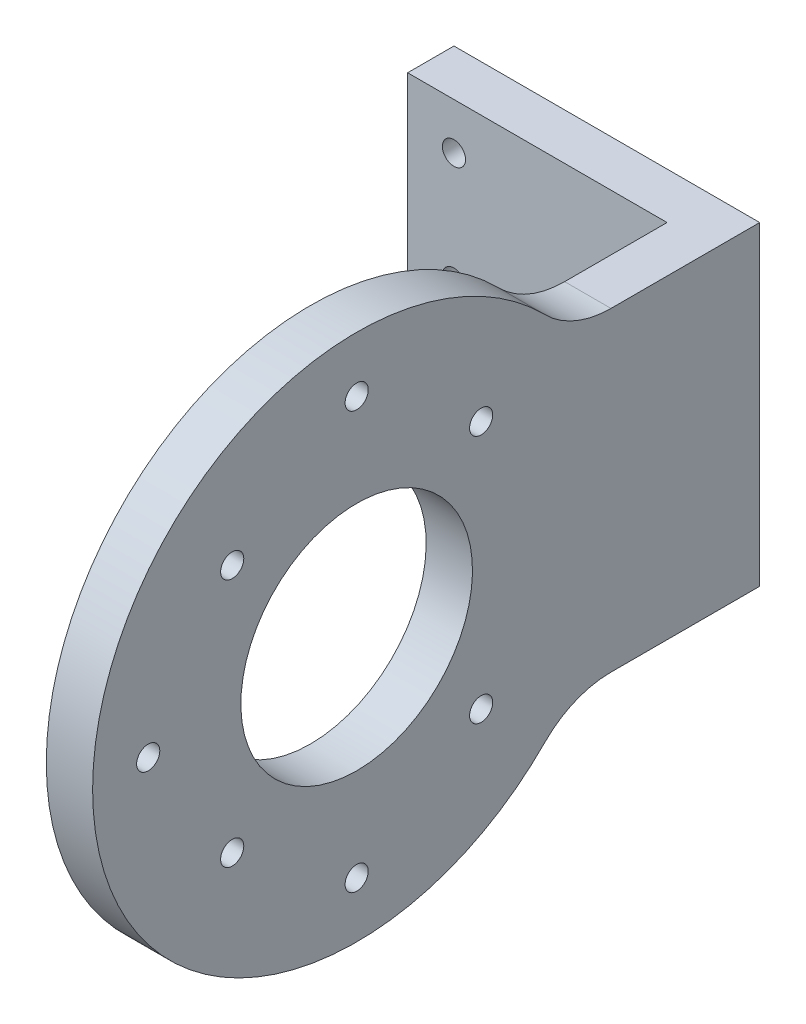
ISO-10303-21;
HEADER;
FILE_DESCRIPTION(('STEP AP214'),'2;1');
FILE_NAME('part.step','',(''),(''),'','','');
FILE_SCHEMA(('AUTOMOTIVE_DESIGN { 1 0 10303 214 1 1 1 1 }'));
ENDSEC;
DATA;
#1=APPLICATION_CONTEXT('core data for automotive mechanical design processes');
#2=APPLICATION_PROTOCOL_DEFINITION('international standard','automotive_design',2000,#1);
#3=PRODUCT_CONTEXT('',#1,'mechanical');
#4=PRODUCT('Part','Part','',(#3));
#5=PRODUCT_RELATED_PRODUCT_CATEGORY('part','',(#4));
#6=PRODUCT_DEFINITION_FORMATION('','',#4);
#7=PRODUCT_DEFINITION_CONTEXT('part definition',#1,'design');
#8=PRODUCT_DEFINITION('design','',#6,#7);
#9=PRODUCT_DEFINITION_SHAPE('','',#8);
#10=(LENGTH_UNIT() NAMED_UNIT(*) SI_UNIT(.MILLI.,.METRE.));
#11=(NAMED_UNIT(*) PLANE_ANGLE_UNIT() SI_UNIT($,.RADIAN.));
#12=(NAMED_UNIT(*) SI_UNIT($,.STERADIAN.) SOLID_ANGLE_UNIT());
#13=UNCERTAINTY_MEASURE_WITH_UNIT(LENGTH_MEASURE(1.E-05),#10,'distance_accuracy_value','');
#14=(GEOMETRIC_REPRESENTATION_CONTEXT(3) GLOBAL_UNCERTAINTY_ASSIGNED_CONTEXT((#13)) GLOBAL_UNIT_ASSIGNED_CONTEXT((#10,
#11,#12)) REPRESENTATION_CONTEXT('',''));
#15=CARTESIAN_POINT('',(0.,0.,0.));
#16=DIRECTION('',(0.,0.,1.));
#17=DIRECTION('',(1.,0.,0.));
#18=AXIS2_PLACEMENT_3D('',#15,#16,#17);
#19=CARTESIAN_POINT('',(28.,17.,5.));
#20=DIRECTION('',(-1.,0.,0.));
#21=DIRECTION('',(0.,-1.,0.));
#22=AXIS2_PLACEMENT_3D('',#19,#20,#21);
#23=PLANE('',#22);
#24=CARTESIAN_POINT('',(28.,0.,66.));
#25=DIRECTION('',(1.,0.,0.));
#26=DIRECTION('',(0.,0.,1.));
#27=AXIS2_PLACEMENT_3D('',#24,#25,#26);
#28=CIRCLE('',#27,1.25);
#29=CARTESIAN_POINT('',(28.,0.,67.25));
#30=VERTEX_POINT('',#29);
#31=EDGE_CURVE('E198',#30,#30,#28,.T.);
#32=ORIENTED_EDGE('',*,*,#31,.F.);
#33=EDGE_LOOP('',(#32));
#34=FACE_BOUND('',#33,.T.);
#35=CARTESIAN_POINT('',(28.,-22.5,43.5));
#36=DIRECTION('',(1.,0.,0.));
#37=DIRECTION('',(0.,-1.,0.));
#38=AXIS2_PLACEMENT_3D('',#35,#36,#37);
#39=CIRCLE('',#38,1.25);
#40=CARTESIAN_POINT('',(28.,-23.75,43.5));
#41=VERTEX_POINT('',#40);
#42=EDGE_CURVE('E205',#41,#41,#39,.T.);
#43=ORIENTED_EDGE('',*,*,#42,.F.);
#44=EDGE_LOOP('',(#43));
#45=FACE_BOUND('',#44,.T.);
#46=CARTESIAN_POINT('',(28.,22.5,43.5));
#47=DIRECTION('',(1.,0.,0.));
#48=DIRECTION('',(0.,1.,0.));
#49=AXIS2_PLACEMENT_3D('',#46,#47,#48);
#50=CIRCLE('',#49,1.25);
#51=CARTESIAN_POINT('',(28.,23.75,43.5));
#52=VERTEX_POINT('',#51);
#53=EDGE_CURVE('E194',#52,#52,#50,.T.);
#54=ORIENTED_EDGE('',*,*,#53,.F.);
#55=EDGE_LOOP('',(#54));
#56=FACE_BOUND('',#55,.T.);
#57=CARTESIAN_POINT('',(28.,-13.4350288425442,56.9350288425446));
#58=DIRECTION('',(-1.,0.,0.));
#59=DIRECTION('',(0.,0.,-1.));
#60=AXIS2_PLACEMENT_3D('',#57,#58,#59);
#61=CIRCLE('',#60,1.25);
#62=CARTESIAN_POINT('',(28.,-13.4350288425442,55.6850288425446));
#63=VERTEX_POINT('',#62);
#64=EDGE_CURVE('E240',#63,#63,#61,.T.);
#65=ORIENTED_EDGE('',*,*,#64,.T.);
#66=EDGE_LOOP('',(#65));
#67=FACE_BOUND('',#66,.T.);
#68=CARTESIAN_POINT('',(28.,-13.4350288425444,30.0649711574557));
#69=DIRECTION('',(-1.,0.,0.));
#70=DIRECTION('',(0.,1.,0.));
#71=AXIS2_PLACEMENT_3D('',#68,#69,#70);
#72=CIRCLE('',#71,1.25);
#73=CARTESIAN_POINT('',(28.,-12.1850288425444,30.0649711574557));
#74=VERTEX_POINT('',#73);
#75=EDGE_CURVE('E248',#74,#74,#72,.T.);
#76=ORIENTED_EDGE('',*,*,#75,.T.);
#77=EDGE_LOOP('',(#76));
#78=FACE_BOUND('',#77,.T.);
#79=CARTESIAN_POINT('',(28.,13.4350288425443,30.0649711574556));
#80=DIRECTION('',(-1.,0.,0.));
#81=DIRECTION('',(0.,0.,1.));
#82=AXIS2_PLACEMENT_3D('',#79,#80,#81);
#83=CIRCLE('',#82,1.25);
#84=CARTESIAN_POINT('',(28.,13.4350288425443,31.3149711574556));
#85=VERTEX_POINT('',#84);
#86=EDGE_CURVE('E256',#85,#85,#83,.T.);
#87=ORIENTED_EDGE('',*,*,#86,.T.);
#88=EDGE_LOOP('',(#87));
#89=FACE_BOUND('',#88,.T.);
#90=CARTESIAN_POINT('',(28.,0.,43.5000000000001));
#91=DIRECTION('',(-1.,0.,0.));
#92=DIRECTION('',(0.,-1.,0.));
#93=AXIS2_PLACEMENT_3D('',#90,#91,#92);
#94=CIRCLE('',#93,12.5);
#95=CARTESIAN_POINT('',(28.,-12.5,43.5000000000001));
#96=VERTEX_POINT('',#95);
#97=EDGE_CURVE('E260',#96,#96,#94,.T.);
#98=ORIENTED_EDGE('',*,*,#97,.T.);
#99=EDGE_LOOP('',(#98));
#100=FACE_BOUND('',#99,.T.);
#101=CARTESIAN_POINT('',(28.,13.4350288425444,56.9350288425444));
#102=DIRECTION('',(-1.,0.,0.));
#103=DIRECTION('',(0.,-1.,0.));
#104=AXIS2_PLACEMENT_3D('',#101,#102,#103);
#105=CIRCLE('',#104,1.25);
#106=CARTESIAN_POINT('',(28.,12.1850288425444,56.9350288425444));
#107=VERTEX_POINT('',#106);
#108=EDGE_CURVE('E272',#107,#107,#105,.T.);
#109=ORIENTED_EDGE('',*,*,#108,.T.);
#110=EDGE_LOOP('',(#109));
#111=FACE_BOUND('',#110,.T.);
#112=CARTESIAN_POINT('',(28.,0.,43.5));
#113=DIRECTION('',(-1.,0.,0.));
#114=DIRECTION('',(0.,-1.,0.));
#115=AXIS2_PLACEMENT_3D('',#112,#113,#114);
#116=CIRCLE('',#115,28.5);
#117=CARTESIAN_POINT('',(28.,-19.987012987013,23.1832750705983));
#118=VERTEX_POINT('',#117);
#119=CARTESIAN_POINT('',(28.,19.987012987013,23.1832750705983));
#120=VERTEX_POINT('',#119);
#121=EDGE_CURVE('E129',#118,#120,#116,.T.);
#122=ORIENTED_EDGE('',*,*,#121,.F.);
#123=CARTESIAN_POINT('',(28.,-27.,16.0545996567731));
#124=DIRECTION('',(-1.,0.,0.));
#125=DIRECTION('',(0.,-1.,0.));
#126=AXIS2_PLACEMENT_3D('',#123,#124,#125);
#127=CIRCLE('',#126,10.);
#128=CARTESIAN_POINT('',(28.,-17.,16.0545996567731));
#129=VERTEX_POINT('',#128);
#130=EDGE_CURVE('E11',#118,#129,#127,.T.);
#131=ORIENTED_EDGE('',*,*,#130,.T.);
#132=DIRECTION('',(0.,0.,-1.));
#133=VECTOR('',#132,1.);
#134=CARTESIAN_POINT('',(28.,-17.,5.));
#135=LINE('',#134,#133);
#136=CARTESIAN_POINT('',(28.,-17.,0.));
#137=VERTEX_POINT('',#136);
#138=EDGE_CURVE('E167',#129,#137,#135,.T.);
#139=ORIENTED_EDGE('',*,*,#138,.T.);
#140=DIRECTION('',(0.,1.,0.));
#141=VECTOR('',#140,1.);
#142=CARTESIAN_POINT('',(28.,17.,0.));
#143=LINE('',#142,#141);
#144=CARTESIAN_POINT('',(28.,17.,0.));
#145=VERTEX_POINT('',#144);
#146=EDGE_CURVE('E119',#137,#145,#143,.T.);
#147=ORIENTED_EDGE('',*,*,#146,.T.);
#148=DIRECTION('',(0.,0.,-1.));
#149=VECTOR('',#148,1.);
#150=CARTESIAN_POINT('',(28.,17.,5.));
#151=LINE('',#150,#149);
#152=CARTESIAN_POINT('',(28.,17.,16.0545996567731));
#153=VERTEX_POINT('',#152);
#154=EDGE_CURVE('E164',#153,#145,#151,.T.);
#155=ORIENTED_EDGE('',*,*,#154,.F.);
#156=CARTESIAN_POINT('',(28.,27.,16.0545996567731));
#157=DIRECTION('',(-1.,0.,0.));
#158=DIRECTION('',(0.,-1.,0.));
#159=AXIS2_PLACEMENT_3D('',#156,#157,#158);
#160=CIRCLE('',#159,10.);
#161=EDGE_CURVE('E180',#153,#120,#160,.T.);
#162=ORIENTED_EDGE('',*,*,#161,.T.);
#163=EDGE_LOOP('',(#122,#131,#139,#147,#155,#162));
#164=FACE_BOUND('',#163,.T.);
#165=ADVANCED_FACE('F43',(#34,#45,#56,#67,#78,#89,#100,#111,#164),#23,.F.);
#166=CARTESIAN_POINT('',(23.,0.,0.));
#167=DIRECTION('',(1.,0.,0.));
#168=DIRECTION('',(0.,1.,0.));
#169=AXIS2_PLACEMENT_3D('',#166,#167,#168);
#170=PLANE('',#169);
#171=CARTESIAN_POINT('',(23.,0.,66.));
#172=DIRECTION('',(1.,0.,0.));
#173=DIRECTION('',(0.,1.,0.));
#174=AXIS2_PLACEMENT_3D('',#171,#172,#173);
#175=CIRCLE('',#174,1.25);
#176=CARTESIAN_POINT('',(23.,1.24999999999991,66.));
#177=VERTEX_POINT('',#176);
#178=EDGE_CURVE('E47',#177,#177,#175,.T.);
#179=ORIENTED_EDGE('',*,*,#178,.T.);
#180=EDGE_LOOP('',(#179));
#181=FACE_BOUND('',#180,.T.);
#182=CARTESIAN_POINT('',(23.,-22.5,43.5));
#183=DIRECTION('',(1.,0.,0.));
#184=DIRECTION('',(0.,1.,0.));
#185=AXIS2_PLACEMENT_3D('',#182,#183,#184);
#186=CIRCLE('',#185,1.25);
#187=CARTESIAN_POINT('',(23.,-21.25,43.5));
#188=VERTEX_POINT('',#187);
#189=EDGE_CURVE('E195',#188,#188,#186,.T.);
#190=ORIENTED_EDGE('',*,*,#189,.T.);
#191=EDGE_LOOP('',(#190));
#192=FACE_BOUND('',#191,.T.);
#193=CARTESIAN_POINT('',(23.,22.5,43.5));
#194=DIRECTION('',(1.,0.,0.));
#195=DIRECTION('',(0.,1.,0.));
#196=AXIS2_PLACEMENT_3D('',#193,#194,#195);
#197=CIRCLE('',#196,1.25);
#198=CARTESIAN_POINT('',(23.,23.75,43.5));
#199=VERTEX_POINT('',#198);
#200=EDGE_CURVE('E190',#199,#199,#197,.T.);
#201=ORIENTED_EDGE('',*,*,#200,.T.);
#202=EDGE_LOOP('',(#201));
#203=FACE_BOUND('',#202,.T.);
#204=CARTESIAN_POINT('',(23.,-13.4350288425442,56.9350288425446));
#205=DIRECTION('',(-1.,0.,0.));
#206=DIRECTION('',(0.,0.,-1.));
#207=AXIS2_PLACEMENT_3D('',#204,#205,#206);
#208=CIRCLE('',#207,1.25);
#209=CARTESIAN_POINT('',(23.,-13.4350288425442,55.6850288425446));
#210=VERTEX_POINT('',#209);
#211=EDGE_CURVE('E236',#210,#210,#208,.T.);
#212=ORIENTED_EDGE('',*,*,#211,.F.);
#213=EDGE_LOOP('',(#212));
#214=FACE_BOUND('',#213,.T.);
#215=CARTESIAN_POINT('',(23.,-13.4350288425444,30.0649711574557));
#216=DIRECTION('',(-1.,0.,0.));
#217=DIRECTION('',(0.,1.,0.));
#218=AXIS2_PLACEMENT_3D('',#215,#216,#217);
#219=CIRCLE('',#218,1.25);
#220=CARTESIAN_POINT('',(23.,-12.1850288425444,30.0649711574557));
#221=VERTEX_POINT('',#220);
#222=EDGE_CURVE('E244',#221,#221,#219,.T.);
#223=ORIENTED_EDGE('',*,*,#222,.F.);
#224=EDGE_LOOP('',(#223));
#225=FACE_BOUND('',#224,.T.);
#226=CARTESIAN_POINT('',(23.,13.4350288425443,30.0649711574556));
#227=DIRECTION('',(-1.,0.,0.));
#228=DIRECTION('',(0.,0.,1.));
#229=AXIS2_PLACEMENT_3D('',#226,#227,#228);
#230=CIRCLE('',#229,1.25);
#231=CARTESIAN_POINT('',(23.,13.4350288425443,31.3149711574556));
#232=VERTEX_POINT('',#231);
#233=EDGE_CURVE('E252',#232,#232,#230,.T.);
#234=ORIENTED_EDGE('',*,*,#233,.F.);
#235=EDGE_LOOP('',(#234));
#236=FACE_BOUND('',#235,.T.);
#237=CARTESIAN_POINT('',(23.,0.,43.5000000000001));
#238=DIRECTION('',(-1.,0.,0.));
#239=DIRECTION('',(0.,-1.,0.));
#240=AXIS2_PLACEMENT_3D('',#237,#238,#239);
#241=CIRCLE('',#240,12.5);
#242=CARTESIAN_POINT('',(23.,-12.5,43.5000000000001));
#243=VERTEX_POINT('',#242);
#244=EDGE_CURVE('E264',#243,#243,#241,.T.);
#245=ORIENTED_EDGE('',*,*,#244,.F.);
#246=EDGE_LOOP('',(#245));
#247=FACE_BOUND('',#246,.T.);
#248=CARTESIAN_POINT('',(23.,13.4350288425444,56.9350288425444));
#249=DIRECTION('',(-1.,0.,0.));
#250=DIRECTION('',(0.,-1.,0.));
#251=AXIS2_PLACEMENT_3D('',#248,#249,#250);
#252=CIRCLE('',#251,1.25);
#253=CARTESIAN_POINT('',(23.,12.1850288425444,56.9350288425444));
#254=VERTEX_POINT('',#253);
#255=EDGE_CURVE('E268',#254,#254,#252,.T.);
#256=ORIENTED_EDGE('',*,*,#255,.F.);
#257=EDGE_LOOP('',(#256));
#258=FACE_BOUND('',#257,.T.);
#259=DIRECTION('',(0.,0.,-1.));
#260=VECTOR('',#259,1.);
#261=CARTESIAN_POINT('',(23.,-16.9999999999998,72.));
#262=LINE('',#261,#260);
#263=CARTESIAN_POINT('',(23.,-17.,16.0545996567731));
#264=VERTEX_POINT('',#263);
#265=CARTESIAN_POINT('',(23.,-17.,5.));
#266=VERTEX_POINT('',#265);
#267=EDGE_CURVE('E108',#264,#266,#262,.T.);
#268=ORIENTED_EDGE('',*,*,#267,.F.);
#269=CARTESIAN_POINT('',(23.,-27.,16.0545996567731));
#270=DIRECTION('',(1.,0.,0.));
#271=DIRECTION('',(0.,1.,0.));
#272=AXIS2_PLACEMENT_3D('',#269,#270,#271);
#273=CIRCLE('',#272,10.);
#274=CARTESIAN_POINT('',(23.,-19.987012987013,23.1832750705983));
#275=VERTEX_POINT('',#274);
#276=EDGE_CURVE('E53',#264,#275,#273,.T.);
#277=ORIENTED_EDGE('',*,*,#276,.T.);
#278=CARTESIAN_POINT('',(23.,0.,43.5));
#279=DIRECTION('',(-1.,0.,0.));
#280=DIRECTION('',(0.,-1.,0.));
#281=AXIS2_PLACEMENT_3D('',#278,#279,#280);
#282=CIRCLE('',#281,28.5);
#283=CARTESIAN_POINT('',(23.,19.987012987013,23.1832750705983));
#284=VERTEX_POINT('',#283);
#285=EDGE_CURVE('E276',#275,#284,#282,.T.);
#286=ORIENTED_EDGE('',*,*,#285,.T.);
#287=CARTESIAN_POINT('',(23.,27.,16.0545996567731));
#288=DIRECTION('',(1.,0.,0.));
#289=DIRECTION('',(0.,1.,0.));
#290=AXIS2_PLACEMENT_3D('',#287,#288,#289);
#291=CIRCLE('',#290,10.);
#292=CARTESIAN_POINT('',(23.,17.,16.0545996567731));
#293=VERTEX_POINT('',#292);
#294=EDGE_CURVE('E177',#284,#293,#291,.T.);
#295=ORIENTED_EDGE('',*,*,#294,.T.);
#296=DIRECTION('',(0.,0.,1.));
#297=VECTOR('',#296,1.);
#298=CARTESIAN_POINT('',(23.,17.,5.));
#299=LINE('',#298,#297);
#300=CARTESIAN_POINT('',(23.,17.,5.));
#301=VERTEX_POINT('',#300);
#302=EDGE_CURVE('E120',#301,#293,#299,.T.);
#303=ORIENTED_EDGE('',*,*,#302,.F.);
#304=DIRECTION('',(0.,1.,0.));
#305=VECTOR('',#304,1.);
#306=CARTESIAN_POINT('',(23.,17.,5.));
#307=LINE('',#306,#305);
#308=EDGE_CURVE('E123',#266,#301,#307,.T.);
#309=ORIENTED_EDGE('',*,*,#308,.F.);
#310=EDGE_LOOP('',(#268,#277,#286,#295,#303,#309));
#311=FACE_BOUND('',#310,.T.);
#312=ADVANCED_FACE('F124',(#181,#192,#203,#214,#225,#236,#247,#258,#311),#170,.F.);
#313=CARTESIAN_POINT('',(0.,0.,5.));
#314=DIRECTION('',(0.,0.,1.));
#315=DIRECTION('',(1.,0.,0.));
#316=AXIS2_PLACEMENT_3D('',#313,#314,#315);
#317=PLANE('',#316);
#318=CARTESIAN_POINT('',(0.,-12.,5.));
#319=DIRECTION('',(0.,0.,1.));
#320=DIRECTION('',(-1.,0.,0.));
#321=AXIS2_PLACEMENT_3D('',#318,#319,#320);
#322=CIRCLE('',#321,1.25);
#323=CARTESIAN_POINT('',(-1.25,-12.,5.));
#324=VERTEX_POINT('',#323);
#325=EDGE_CURVE('E225',#324,#324,#322,.T.);
#326=ORIENTED_EDGE('',*,*,#325,.F.);
#327=EDGE_LOOP('',(#326));
#328=FACE_BOUND('',#327,.T.);
#329=CARTESIAN_POINT('',(0.,12.,5.));
#330=DIRECTION('',(0.,0.,1.));
#331=DIRECTION('',(1.,0.,0.));
#332=AXIS2_PLACEMENT_3D('',#329,#330,#331);
#333=CIRCLE('',#332,1.25);
#334=CARTESIAN_POINT('',(1.25,12.,5.));
#335=VERTEX_POINT('',#334);
#336=EDGE_CURVE('E216',#335,#335,#333,.T.);
#337=ORIENTED_EDGE('',*,*,#336,.F.);
#338=EDGE_LOOP('',(#337));
#339=FACE_BOUND('',#338,.T.);
#340=CARTESIAN_POINT('',(0.,0.,5.));
#341=DIRECTION('',(0.,0.,1.));
#342=DIRECTION('',(1.,0.,0.));
#343=AXIS2_PLACEMENT_3D('',#340,#341,#342);
#344=CIRCLE('',#343,1.25);
#345=CARTESIAN_POINT('',(1.25,0.,5.));
#346=VERTEX_POINT('',#345);
#347=EDGE_CURVE('E220',#346,#346,#344,.T.);
#348=ORIENTED_EDGE('',*,*,#347,.F.);
#349=EDGE_LOOP('',(#348));
#350=FACE_BOUND('',#349,.T.);
#351=DIRECTION('',(1.,0.,0.));
#352=VECTOR('',#351,1.);
#353=CARTESIAN_POINT('',(28.,-17.,5.));
#354=LINE('',#353,#352);
#355=CARTESIAN_POINT('',(-5.,-17.,5.));
#356=VERTEX_POINT('',#355);
#357=EDGE_CURVE('E114',#356,#266,#354,.T.);
#358=ORIENTED_EDGE('',*,*,#357,.T.);
#359=ORIENTED_EDGE('',*,*,#308,.T.);
#360=DIRECTION('',(-1.,0.,0.));
#361=VECTOR('',#360,1.);
#362=CARTESIAN_POINT('',(23.,17.,5.));
#363=LINE('',#362,#361);
#364=CARTESIAN_POINT('',(-5.,17.,5.));
#365=VERTEX_POINT('',#364);
#366=EDGE_CURVE('E136',#301,#365,#363,.T.);
#367=ORIENTED_EDGE('',*,*,#366,.T.);
#368=DIRECTION('',(0.,-1.,0.));
#369=VECTOR('',#368,1.);
#370=CARTESIAN_POINT('',(-5.,17.,5.));
#371=LINE('',#370,#369);
#372=EDGE_CURVE('E133',#365,#356,#371,.T.);
#373=ORIENTED_EDGE('',*,*,#372,.T.);
#374=EDGE_LOOP('',(#358,#359,#367,#373));
#375=FACE_BOUND('',#374,.T.);
#376=ADVANCED_FACE('F131',(#328,#339,#350,#375),#317,.T.);
#377=CARTESIAN_POINT('',(-5.,17.,5.));
#378=DIRECTION('',(0.,-1.,0.));
#379=DIRECTION('',(0.,0.,-1.));
#380=AXIS2_PLACEMENT_3D('',#377,#378,#379);
#381=PLANE('',#380);
#382=ORIENTED_EDGE('',*,*,#302,.T.);
#383=DIRECTION('',(-1.,0.,0.));
#384=VECTOR('',#383,1.);
#385=CARTESIAN_POINT('',(-5.00000000000001,17.,16.0545996567731));
#386=LINE('',#385,#384);
#387=EDGE_CURVE('E174',#293,#153,#386,.F.);
#388=ORIENTED_EDGE('',*,*,#387,.T.);
#389=ORIENTED_EDGE('',*,*,#154,.T.);
#390=DIRECTION('',(-1.,0.,0.));
#391=VECTOR('',#390,1.);
#392=CARTESIAN_POINT('',(-5.,17.,0.));
#393=LINE('',#392,#391);
#394=CARTESIAN_POINT('',(-5.,17.,0.));
#395=VERTEX_POINT('',#394);
#396=EDGE_CURVE('E153',#145,#395,#393,.T.);
#397=ORIENTED_EDGE('',*,*,#396,.T.);
#398=DIRECTION('',(0.,0.,-1.));
#399=VECTOR('',#398,1.);
#400=CARTESIAN_POINT('',(-5.,17.,5.));
#401=LINE('',#400,#399);
#402=EDGE_CURVE('E160',#365,#395,#401,.T.);
#403=ORIENTED_EDGE('',*,*,#402,.F.);
#404=ORIENTED_EDGE('',*,*,#366,.F.);
#405=EDGE_LOOP('',(#382,#388,#389,#397,#403,#404));
#406=FACE_BOUND('',#405,.T.);
#407=ADVANCED_FACE('F286',(#406),#381,.F.);
#408=CARTESIAN_POINT('',(-5.,17.,5.));
#409=DIRECTION('',(1.,0.,0.));
#410=DIRECTION('',(0.,1.,0.));
#411=AXIS2_PLACEMENT_3D('',#408,#409,#410);
#412=PLANE('',#411);
#413=DIRECTION('',(0.,-1.,0.));
#414=VECTOR('',#413,1.);
#415=CARTESIAN_POINT('',(-5.,17.,0.));
#416=LINE('',#415,#414);
#417=CARTESIAN_POINT('',(-5.,-17.,0.));
#418=VERTEX_POINT('',#417);
#419=EDGE_CURVE('E143',#395,#418,#416,.T.);
#420=ORIENTED_EDGE('',*,*,#419,.T.);
#421=DIRECTION('',(0.,0.,-1.));
#422=VECTOR('',#421,1.);
#423=CARTESIAN_POINT('',(-5.,-17.,5.));
#424=LINE('',#423,#422);
#425=EDGE_CURVE('E149',#356,#418,#424,.T.);
#426=ORIENTED_EDGE('',*,*,#425,.F.);
#427=ORIENTED_EDGE('',*,*,#372,.F.);
#428=ORIENTED_EDGE('',*,*,#402,.T.);
#429=EDGE_LOOP('',(#420,#426,#427,#428));
#430=FACE_BOUND('',#429,.T.);
#431=ADVANCED_FACE('F303',(#430),#412,.F.);
#432=CARTESIAN_POINT('',(-5.,-17.,5.));
#433=DIRECTION('',(0.,1.,0.));
#434=DIRECTION('',(-1.,0.,0.));
#435=AXIS2_PLACEMENT_3D('',#432,#433,#434);
#436=PLANE('',#435);
#437=ORIENTED_EDGE('',*,*,#138,.F.);
#438=DIRECTION('',(-1.,0.,0.));
#439=VECTOR('',#438,1.);
#440=CARTESIAN_POINT('',(-5.,-17.,16.0545996567731));
#441=LINE('',#440,#439);
#442=EDGE_CURVE('E117',#129,#264,#441,.T.);
#443=ORIENTED_EDGE('',*,*,#442,.T.);
#444=ORIENTED_EDGE('',*,*,#267,.T.);
#445=ORIENTED_EDGE('',*,*,#357,.F.);
#446=ORIENTED_EDGE('',*,*,#425,.T.);
#447=DIRECTION('',(1.,0.,0.));
#448=VECTOR('',#447,1.);
#449=CARTESIAN_POINT('',(-5.,-17.,0.));
#450=LINE('',#449,#448);
#451=EDGE_CURVE('E137',#418,#137,#450,.T.);
#452=ORIENTED_EDGE('',*,*,#451,.T.);
#453=EDGE_LOOP('',(#437,#443,#444,#445,#446,#452));
#454=FACE_BOUND('',#453,.T.);
#455=ADVANCED_FACE('F111',(#454),#436,.F.);
#456=CARTESIAN_POINT('',(0.,0.,0.));
#457=DIRECTION('',(0.,0.,1.));
#458=DIRECTION('',(1.,0.,0.));
#459=AXIS2_PLACEMENT_3D('',#456,#457,#458);
#460=PLANE('',#459);
#461=CARTESIAN_POINT('',(0.,-12.,0.));
#462=DIRECTION('',(0.,0.,1.));
#463=DIRECTION('',(-1.,0.,0.));
#464=AXIS2_PLACEMENT_3D('',#461,#462,#463);
#465=CIRCLE('',#464,1.25);
#466=CARTESIAN_POINT('',(-1.25,-12.,0.));
#467=VERTEX_POINT('',#466);
#468=EDGE_CURVE('E193',#467,#467,#465,.T.);
#469=ORIENTED_EDGE('',*,*,#468,.T.);
#470=EDGE_LOOP('',(#469));
#471=FACE_BOUND('',#470,.T.);
#472=CARTESIAN_POINT('',(0.,12.,0.));
#473=DIRECTION('',(0.,0.,1.));
#474=DIRECTION('',(1.,0.,0.));
#475=AXIS2_PLACEMENT_3D('',#472,#473,#474);
#476=CIRCLE('',#475,1.25);
#477=CARTESIAN_POINT('',(1.25,12.,0.));
#478=VERTEX_POINT('',#477);
#479=EDGE_CURVE('E221',#478,#478,#476,.T.);
#480=ORIENTED_EDGE('',*,*,#479,.T.);
#481=EDGE_LOOP('',(#480));
#482=FACE_BOUND('',#481,.T.);
#483=CARTESIAN_POINT('',(0.,0.,0.));
#484=DIRECTION('',(0.,0.,1.));
#485=DIRECTION('',(1.,0.,0.));
#486=AXIS2_PLACEMENT_3D('',#483,#484,#485);
#487=CIRCLE('',#486,1.25);
#488=CARTESIAN_POINT('',(1.25,0.,0.));
#489=VERTEX_POINT('',#488);
#490=EDGE_CURVE('E232',#489,#489,#487,.T.);
#491=ORIENTED_EDGE('',*,*,#490,.T.);
#492=EDGE_LOOP('',(#491));
#493=FACE_BOUND('',#492,.T.);
#494=ORIENTED_EDGE('',*,*,#146,.F.);
#495=ORIENTED_EDGE('',*,*,#451,.F.);
#496=ORIENTED_EDGE('',*,*,#419,.F.);
#497=ORIENTED_EDGE('',*,*,#396,.F.);
#498=EDGE_LOOP('',(#494,#495,#496,#497));
#499=FACE_BOUND('',#498,.T.);
#500=ADVANCED_FACE('F300',(#471,#482,#493,#499),#460,.F.);
#501=CARTESIAN_POINT('',(28.,0.,43.5));
#502=DIRECTION('',(-1.,0.,0.));
#503=DIRECTION('',(0.,-1.,0.));
#504=AXIS2_PLACEMENT_3D('',#501,#502,#503);
#505=CYLINDRICAL_SURFACE('',#504,28.5);
#506=ORIENTED_EDGE('',*,*,#285,.F.);
#507=DIRECTION('',(-1.,0.,0.));
#508=VECTOR('',#507,1.);
#509=CARTESIAN_POINT('',(28.,-19.987012987013,23.1832750705983));
#510=LINE('',#509,#508);
#511=EDGE_CURVE('E67',#275,#118,#510,.F.);
#512=ORIENTED_EDGE('',*,*,#511,.T.);
#513=ORIENTED_EDGE('',*,*,#121,.T.);
#514=DIRECTION('',(-1.,0.,0.));
#515=VECTOR('',#514,1.);
#516=CARTESIAN_POINT('',(28.,19.987012987013,23.1832750705983));
#517=LINE('',#516,#515);
#518=EDGE_CURVE('E170',#120,#284,#517,.T.);
#519=ORIENTED_EDGE('',*,*,#518,.T.);
#520=EDGE_LOOP('',(#506,#512,#513,#519));
#521=FACE_BOUND('',#520,.T.);
#522=ADVANCED_FACE('F314',(#521),#505,.T.);
#523=CARTESIAN_POINT('',(28.,27.,16.0545996567731));
#524=DIRECTION('',(-1.,0.,0.));
#525=DIRECTION('',(0.,-1.,0.));
#526=AXIS2_PLACEMENT_3D('',#523,#524,#525);
#527=CYLINDRICAL_SURFACE('',#526,10.);
#528=ORIENTED_EDGE('',*,*,#161,.F.);
#529=ORIENTED_EDGE('',*,*,#387,.F.);
#530=ORIENTED_EDGE('',*,*,#294,.F.);
#531=ORIENTED_EDGE('',*,*,#518,.F.);
#532=EDGE_LOOP('',(#528,#529,#530,#531));
#533=FACE_BOUND('',#532,.T.);
#534=ADVANCED_FACE('F292',(#533),#527,.F.);
#535=CARTESIAN_POINT('',(28.,-27.,16.0545996567731));
#536=DIRECTION('',(-1.,0.,0.));
#537=DIRECTION('',(0.,-1.,0.));
#538=AXIS2_PLACEMENT_3D('',#535,#536,#537);
#539=CYLINDRICAL_SURFACE('',#538,10.);
#540=ORIENTED_EDGE('',*,*,#130,.F.);
#541=ORIENTED_EDGE('',*,*,#511,.F.);
#542=ORIENTED_EDGE('',*,*,#276,.F.);
#543=ORIENTED_EDGE('',*,*,#442,.F.);
#544=EDGE_LOOP('',(#540,#541,#542,#543));
#545=FACE_BOUND('',#544,.T.);
#546=ADVANCED_FACE('F45',(#545),#539,.F.);
#547=CARTESIAN_POINT('',(28.,13.4350288425444,56.9350288425444));
#548=DIRECTION('',(-1.,0.,0.));
#549=DIRECTION('',(0.,-1.,0.));
#550=AXIS2_PLACEMENT_3D('',#547,#548,#549);
#551=CYLINDRICAL_SURFACE('',#550,1.25);
#552=ORIENTED_EDGE('',*,*,#108,.F.);
#553=EDGE_LOOP('',(#552));
#554=FACE_BOUND('',#553,.T.);
#555=ORIENTED_EDGE('',*,*,#255,.T.);
#556=EDGE_LOOP('',(#555));
#557=FACE_BOUND('',#556,.T.);
#558=ADVANCED_FACE('F306',(#554,#557),#551,.F.);
#559=CARTESIAN_POINT('',(28.,0.,43.5000000000001));
#560=DIRECTION('',(-1.,0.,0.));
#561=DIRECTION('',(0.,-1.,0.));
#562=AXIS2_PLACEMENT_3D('',#559,#560,#561);
#563=CYLINDRICAL_SURFACE('',#562,12.5);
#564=ORIENTED_EDGE('',*,*,#97,.F.);
#565=EDGE_LOOP('',(#564));
#566=FACE_BOUND('',#565,.T.);
#567=ORIENTED_EDGE('',*,*,#244,.T.);
#568=EDGE_LOOP('',(#567));
#569=FACE_BOUND('',#568,.T.);
#570=ADVANCED_FACE('F311',(#566,#569),#563,.F.);
#571=CARTESIAN_POINT('',(28.,13.4350288425443,30.0649711574556));
#572=DIRECTION('',(-1.,0.,0.));
#573=DIRECTION('',(0.,-1.,0.));
#574=AXIS2_PLACEMENT_3D('',#571,#572,#573);
#575=CYLINDRICAL_SURFACE('',#574,1.25);
#576=ORIENTED_EDGE('',*,*,#86,.F.);
#577=EDGE_LOOP('',(#576));
#578=FACE_BOUND('',#577,.T.);
#579=ORIENTED_EDGE('',*,*,#233,.T.);
#580=EDGE_LOOP('',(#579));
#581=FACE_BOUND('',#580,.T.);
#582=ADVANCED_FACE('F341',(#578,#581),#575,.F.);
#583=CARTESIAN_POINT('',(28.,-13.4350288425444,30.0649711574557));
#584=DIRECTION('',(-1.,0.,0.));
#585=DIRECTION('',(0.,-1.,0.));
#586=AXIS2_PLACEMENT_3D('',#583,#584,#585);
#587=CYLINDRICAL_SURFACE('',#586,1.25);
#588=ORIENTED_EDGE('',*,*,#75,.F.);
#589=EDGE_LOOP('',(#588));
#590=FACE_BOUND('',#589,.T.);
#591=ORIENTED_EDGE('',*,*,#222,.T.);
#592=EDGE_LOOP('',(#591));
#593=FACE_BOUND('',#592,.T.);
#594=ADVANCED_FACE('F345',(#590,#593),#587,.F.);
#595=CARTESIAN_POINT('',(28.,-13.4350288425442,56.9350288425446));
#596=DIRECTION('',(-1.,0.,0.));
#597=DIRECTION('',(0.,-1.,0.));
#598=AXIS2_PLACEMENT_3D('',#595,#596,#597);
#599=CYLINDRICAL_SURFACE('',#598,1.25);
#600=ORIENTED_EDGE('',*,*,#64,.F.);
#601=EDGE_LOOP('',(#600));
#602=FACE_BOUND('',#601,.T.);
#603=ORIENTED_EDGE('',*,*,#211,.T.);
#604=EDGE_LOOP('',(#603));
#605=FACE_BOUND('',#604,.T.);
#606=ADVANCED_FACE('F349',(#602,#605),#599,.F.);
#607=CARTESIAN_POINT('',(0.,0.,0.));
#608=DIRECTION('',(0.,0.,1.));
#609=DIRECTION('',(1.,0.,0.));
#610=AXIS2_PLACEMENT_3D('',#607,#608,#609);
#611=CYLINDRICAL_SURFACE('',#610,1.25);
#612=ORIENTED_EDGE('',*,*,#490,.F.);
#613=EDGE_LOOP('',(#612));
#614=FACE_BOUND('',#613,.T.);
#615=ORIENTED_EDGE('',*,*,#347,.T.);
#616=EDGE_LOOP('',(#615));
#617=FACE_BOUND('',#616,.T.);
#618=ADVANCED_FACE('F353',(#614,#617),#611,.F.);
#619=CARTESIAN_POINT('',(0.,12.,0.));
#620=DIRECTION('',(0.,0.,1.));
#621=DIRECTION('',(1.,0.,0.));
#622=AXIS2_PLACEMENT_3D('',#619,#620,#621);
#623=CYLINDRICAL_SURFACE('',#622,1.25);
#624=ORIENTED_EDGE('',*,*,#479,.F.);
#625=EDGE_LOOP('',(#624));
#626=FACE_BOUND('',#625,.T.);
#627=ORIENTED_EDGE('',*,*,#336,.T.);
#628=EDGE_LOOP('',(#627));
#629=FACE_BOUND('',#628,.T.);
#630=ADVANCED_FACE('F357',(#626,#629),#623,.F.);
#631=CARTESIAN_POINT('',(0.,-12.,0.));
#632=DIRECTION('',(0.,0.,1.));
#633=DIRECTION('',(1.,0.,0.));
#634=AXIS2_PLACEMENT_3D('',#631,#632,#633);
#635=CYLINDRICAL_SURFACE('',#634,1.25);
#636=ORIENTED_EDGE('',*,*,#468,.F.);
#637=EDGE_LOOP('',(#636));
#638=FACE_BOUND('',#637,.T.);
#639=ORIENTED_EDGE('',*,*,#325,.T.);
#640=EDGE_LOOP('',(#639));
#641=FACE_BOUND('',#640,.T.);
#642=ADVANCED_FACE('F359',(#638,#641),#635,.F.);
#643=CARTESIAN_POINT('',(18.,22.5,43.5));
#644=DIRECTION('',(1.,0.,0.));
#645=DIRECTION('',(0.,1.,0.));
#646=AXIS2_PLACEMENT_3D('',#643,#644,#645);
#647=CYLINDRICAL_SURFACE('',#646,1.25);
#648=ORIENTED_EDGE('',*,*,#53,.T.);
#649=EDGE_LOOP('',(#648));
#650=FACE_BOUND('',#649,.T.);
#651=ORIENTED_EDGE('',*,*,#200,.F.);
#652=EDGE_LOOP('',(#651));
#653=FACE_BOUND('',#652,.T.);
#654=ADVANCED_FACE('F362',(#650,#653),#647,.F.);
#655=CARTESIAN_POINT('',(18.,-22.5,43.5));
#656=DIRECTION('',(1.,0.,0.));
#657=DIRECTION('',(0.,1.,0.));
#658=AXIS2_PLACEMENT_3D('',#655,#656,#657);
#659=CYLINDRICAL_SURFACE('',#658,1.25);
#660=ORIENTED_EDGE('',*,*,#42,.T.);
#661=EDGE_LOOP('',(#660));
#662=FACE_BOUND('',#661,.T.);
#663=ORIENTED_EDGE('',*,*,#189,.F.);
#664=EDGE_LOOP('',(#663));
#665=FACE_BOUND('',#664,.T.);
#666=ADVANCED_FACE('F369',(#662,#665),#659,.F.);
#667=CARTESIAN_POINT('',(18.,0.,66.));
#668=DIRECTION('',(1.,0.,0.));
#669=DIRECTION('',(0.,1.,0.));
#670=AXIS2_PLACEMENT_3D('',#667,#668,#669);
#671=CYLINDRICAL_SURFACE('',#670,1.25);
#672=ORIENTED_EDGE('',*,*,#31,.T.);
#673=EDGE_LOOP('',(#672));
#674=FACE_BOUND('',#673,.T.);
#675=ORIENTED_EDGE('',*,*,#178,.F.);
#676=EDGE_LOOP('',(#675));
#677=FACE_BOUND('',#676,.T.);
#678=ADVANCED_FACE('F373',(#674,#677),#671,.F.);
#679=CLOSED_SHELL('',(#165,#312,#376,#407,#431,#455,#500,#522,#534,#546,#558,#570,#582,#594,
#606,#618,#630,#642,#654,#666,#678));
#680=MANIFOLD_SOLID_BREP('B2',#679);
#681=ADVANCED_BREP_SHAPE_REPRESENTATION('',(#18,#680),#14);
#682=SHAPE_DEFINITION_REPRESENTATION(#9,#681);
ENDSEC;
END-ISO-10303-21;
